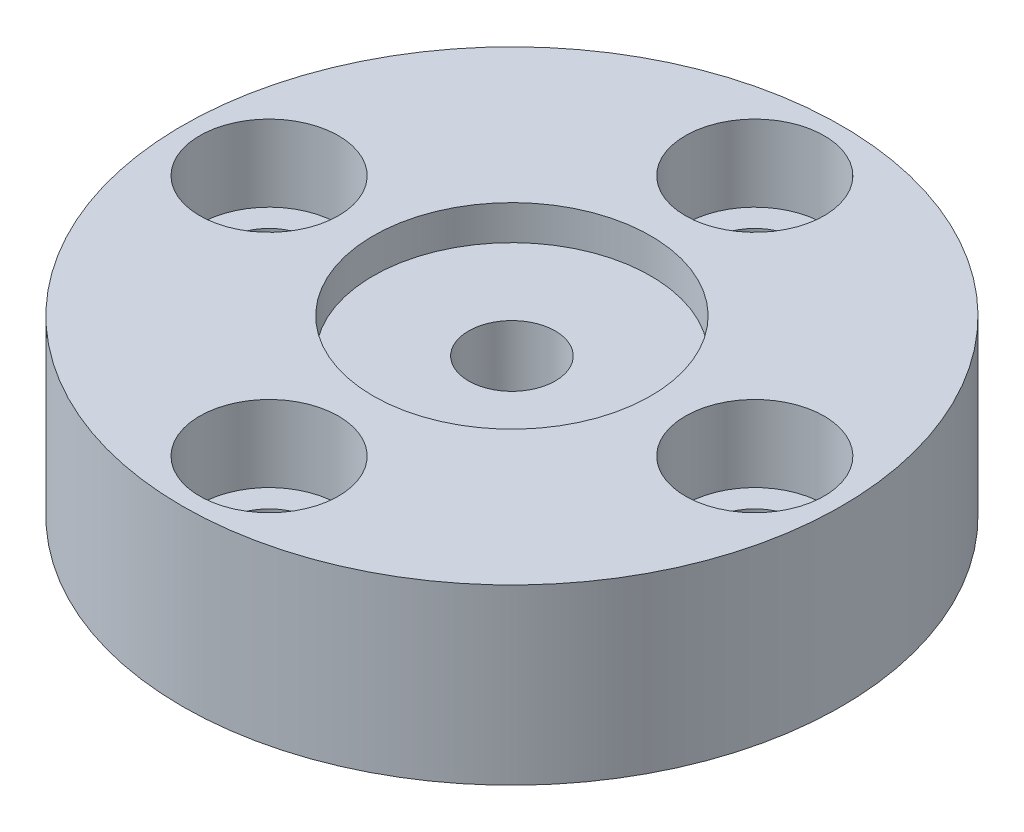
ISO-10303-21;
HEADER;
FILE_DESCRIPTION(('STEP AP214'),'2;1');
FILE_NAME('part.step','',(''),(''),'','','');
FILE_SCHEMA(('AUTOMOTIVE_DESIGN { 1 0 10303 214 1 1 1 1 }'));
ENDSEC;
DATA;
#1=APPLICATION_CONTEXT('core data for automotive mechanical design processes');
#2=APPLICATION_PROTOCOL_DEFINITION('international standard','automotive_design',2000,#1);
#3=PRODUCT_CONTEXT('',#1,'mechanical');
#4=PRODUCT('Part','Part','',(#3));
#5=PRODUCT_RELATED_PRODUCT_CATEGORY('part','',(#4));
#6=PRODUCT_DEFINITION_FORMATION('','',#4);
#7=PRODUCT_DEFINITION_CONTEXT('part definition',#1,'design');
#8=PRODUCT_DEFINITION('design','',#6,#7);
#9=PRODUCT_DEFINITION_SHAPE('','',#8);
#10=(LENGTH_UNIT() NAMED_UNIT(*) SI_UNIT(.MILLI.,.METRE.));
#11=(NAMED_UNIT(*) PLANE_ANGLE_UNIT() SI_UNIT($,.RADIAN.));
#12=(NAMED_UNIT(*) SI_UNIT($,.STERADIAN.) SOLID_ANGLE_UNIT());
#13=UNCERTAINTY_MEASURE_WITH_UNIT(LENGTH_MEASURE(1.E-05),#10,'distance_accuracy_value','');
#14=(GEOMETRIC_REPRESENTATION_CONTEXT(3) GLOBAL_UNCERTAINTY_ASSIGNED_CONTEXT((#13)) GLOBAL_UNIT_ASSIGNED_CONTEXT((#10,
#11,#12)) REPRESENTATION_CONTEXT('',''));
#15=CARTESIAN_POINT('',(0.,0.,0.));
#16=DIRECTION('',(0.,0.,1.));
#17=DIRECTION('',(1.,0.,0.));
#18=AXIS2_PLACEMENT_3D('',#15,#16,#17);
#19=CARTESIAN_POINT('',(0.,10.,0.));
#20=DIRECTION('',(0.,-1.,0.));
#21=DIRECTION('',(0.,0.,-1.));
#22=AXIS2_PLACEMENT_3D('',#19,#20,#21);
#23=CYLINDRICAL_SURFACE('',#22,19.);
#24=CARTESIAN_POINT('',(0.,10.,0.));
#25=DIRECTION('',(0.,1.,0.));
#26=DIRECTION('',(0.,0.,1.));
#27=AXIS2_PLACEMENT_3D('',#24,#25,#26);
#28=CIRCLE('',#27,19.);
#29=CARTESIAN_POINT('',(0.,10.,19.));
#30=VERTEX_POINT('',#29);
#31=EDGE_CURVE('E10',#30,#30,#28,.T.);
#32=ORIENTED_EDGE('',*,*,#31,.F.);
#33=EDGE_LOOP('',(#32));
#34=FACE_BOUND('',#33,.T.);
#35=CARTESIAN_POINT('',(0.,0.,0.));
#36=DIRECTION('',(0.,1.,0.));
#37=DIRECTION('',(0.,0.,1.));
#38=AXIS2_PLACEMENT_3D('',#35,#36,#37);
#39=CIRCLE('',#38,19.);
#40=CARTESIAN_POINT('',(0.,0.,19.));
#41=VERTEX_POINT('',#40);
#42=EDGE_CURVE('E51',#41,#41,#39,.T.);
#43=ORIENTED_EDGE('',*,*,#42,.T.);
#44=EDGE_LOOP('',(#43));
#45=FACE_BOUND('',#44,.T.);
#46=ADVANCED_FACE('F43',(#34,#45),#23,.T.);
#47=CARTESIAN_POINT('',(0.,10.,0.));
#48=DIRECTION('',(0.,1.,0.));
#49=DIRECTION('',(0.,0.,1.));
#50=AXIS2_PLACEMENT_3D('',#47,#48,#49);
#51=PLANE('',#50);
#52=CARTESIAN_POINT('',(-14.,10.,0.));
#53=DIRECTION('',(0.,1.,0.));
#54=DIRECTION('',(1.,0.,0.));
#55=AXIS2_PLACEMENT_3D('',#52,#53,#54);
#56=CIRCLE('',#55,4.);
#57=CARTESIAN_POINT('',(-10.,10.,0.));
#58=VERTEX_POINT('',#57);
#59=EDGE_CURVE('E135',#58,#58,#56,.T.);
#60=ORIENTED_EDGE('',*,*,#59,.F.);
#61=EDGE_LOOP('',(#60));
#62=FACE_BOUND('',#61,.T.);
#63=CARTESIAN_POINT('',(0.,10.,14.));
#64=DIRECTION('',(0.,1.,0.));
#65=DIRECTION('',(0.,0.,-1.));
#66=AXIS2_PLACEMENT_3D('',#63,#64,#65);
#67=CIRCLE('',#66,4.);
#68=CARTESIAN_POINT('',(0.,10.,10.));
#69=VERTEX_POINT('',#68);
#70=EDGE_CURVE('E121',#69,#69,#67,.T.);
#71=ORIENTED_EDGE('',*,*,#70,.F.);
#72=EDGE_LOOP('',(#71));
#73=FACE_BOUND('',#72,.T.);
#74=CARTESIAN_POINT('',(14.,10.,-1.46642216231412E-13));
#75=DIRECTION('',(0.,1.,0.));
#76=DIRECTION('',(-1.,0.,0.));
#77=AXIS2_PLACEMENT_3D('',#74,#75,#76);
#78=CIRCLE('',#77,4.);
#79=CARTESIAN_POINT('',(10.,10.,-1.04744440165294E-13));
#80=VERTEX_POINT('',#79);
#81=EDGE_CURVE('E104',#80,#80,#78,.T.);
#82=ORIENTED_EDGE('',*,*,#81,.F.);
#83=EDGE_LOOP('',(#82));
#84=FACE_BOUND('',#83,.T.);
#85=CARTESIAN_POINT('',(0.,10.,-14.));
#86=DIRECTION('',(0.,1.,0.));
#87=DIRECTION('',(0.,0.,1.));
#88=AXIS2_PLACEMENT_3D('',#85,#86,#87);
#89=CIRCLE('',#88,4.);
#90=CARTESIAN_POINT('',(0.,10.,-10.));
#91=VERTEX_POINT('',#90);
#92=EDGE_CURVE('E79',#91,#91,#89,.T.);
#93=ORIENTED_EDGE('',*,*,#92,.F.);
#94=EDGE_LOOP('',(#93));
#95=FACE_BOUND('',#94,.T.);
#96=CARTESIAN_POINT('',(0.,10.,0.));
#97=DIRECTION('',(0.,1.,0.));
#98=DIRECTION('',(0.,0.,1.));
#99=AXIS2_PLACEMENT_3D('',#96,#97,#98);
#100=CIRCLE('',#99,8.);
#101=CARTESIAN_POINT('',(0.,10.,8.));
#102=VERTEX_POINT('',#101);
#103=EDGE_CURVE('E59',#102,#102,#100,.T.);
#104=ORIENTED_EDGE('',*,*,#103,.F.);
#105=EDGE_LOOP('',(#104));
#106=FACE_BOUND('',#105,.T.);
#107=ORIENTED_EDGE('',*,*,#31,.T.);
#108=EDGE_LOOP('',(#107));
#109=FACE_BOUND('',#108,.T.);
#110=ADVANCED_FACE('F165',(#62,#73,#84,#95,#106,#109),#51,.T.);
#111=CARTESIAN_POINT('',(0.,0.,0.));
#112=DIRECTION('',(0.,1.,0.));
#113=DIRECTION('',(0.,0.,1.));
#114=AXIS2_PLACEMENT_3D('',#111,#112,#113);
#115=PLANE('',#114);
#116=CARTESIAN_POINT('',(-14.,0.,0.));
#117=DIRECTION('',(0.,1.,0.));
#118=DIRECTION('',(1.,0.,0.));
#119=AXIS2_PLACEMENT_3D('',#116,#117,#118);
#120=CIRCLE('',#119,2.5);
#121=CARTESIAN_POINT('',(-11.5,0.,0.));
#122=VERTEX_POINT('',#121);
#123=EDGE_CURVE('E116',#122,#122,#120,.T.);
#124=ORIENTED_EDGE('',*,*,#123,.T.);
#125=EDGE_LOOP('',(#124));
#126=FACE_BOUND('',#125,.T.);
#127=CARTESIAN_POINT('',(0.,0.,14.));
#128=DIRECTION('',(0.,1.,0.));
#129=DIRECTION('',(0.,0.,-1.));
#130=AXIS2_PLACEMENT_3D('',#127,#128,#129);
#131=CIRCLE('',#130,2.5);
#132=CARTESIAN_POINT('',(0.,0.,11.5));
#133=VERTEX_POINT('',#132);
#134=EDGE_CURVE('E99',#133,#133,#131,.T.);
#135=ORIENTED_EDGE('',*,*,#134,.T.);
#136=EDGE_LOOP('',(#135));
#137=FACE_BOUND('',#136,.T.);
#138=CARTESIAN_POINT('',(14.,0.,-1.46642216231412E-13));
#139=DIRECTION('',(0.,1.,0.));
#140=DIRECTION('',(-1.,0.,0.));
#141=AXIS2_PLACEMENT_3D('',#138,#139,#140);
#142=CIRCLE('',#141,2.5);
#143=CARTESIAN_POINT('',(11.5,0.,-1.20456106190088E-13));
#144=VERTEX_POINT('',#143);
#145=EDGE_CURVE('E108',#144,#144,#142,.T.);
#146=ORIENTED_EDGE('',*,*,#145,.T.);
#147=EDGE_LOOP('',(#146));
#148=FACE_BOUND('',#147,.T.);
#149=CARTESIAN_POINT('',(0.,0.,-14.));
#150=DIRECTION('',(0.,1.,0.));
#151=DIRECTION('',(0.,0.,1.));
#152=AXIS2_PLACEMENT_3D('',#149,#150,#151);
#153=CIRCLE('',#152,2.5);
#154=CARTESIAN_POINT('',(0.,0.,-11.5));
#155=VERTEX_POINT('',#154);
#156=EDGE_CURVE('E83',#155,#155,#153,.T.);
#157=ORIENTED_EDGE('',*,*,#156,.T.);
#158=EDGE_LOOP('',(#157));
#159=FACE_BOUND('',#158,.T.);
#160=CARTESIAN_POINT('',(0.,0.,0.));
#161=DIRECTION('',(0.,-1.,0.));
#162=DIRECTION('',(0.,0.,-1.));
#163=AXIS2_PLACEMENT_3D('',#160,#161,#162);
#164=CIRCLE('',#163,6.);
#165=CARTESIAN_POINT('',(0.,0.,-6.));
#166=VERTEX_POINT('',#165);
#167=EDGE_CURVE('E67',#166,#166,#164,.T.);
#168=ORIENTED_EDGE('',*,*,#167,.F.);
#169=EDGE_LOOP('',(#168));
#170=FACE_BOUND('',#169,.T.);
#171=ORIENTED_EDGE('',*,*,#42,.F.);
#172=EDGE_LOOP('',(#171));
#173=FACE_BOUND('',#172,.T.);
#174=ADVANCED_FACE('F143',(#126,#137,#148,#159,#170,#173),#115,.F.);
#175=CARTESIAN_POINT('',(0.,8.,0.));
#176=DIRECTION('',(0.,1.,0.));
#177=DIRECTION('',(0.,0.,1.));
#178=AXIS2_PLACEMENT_3D('',#175,#176,#177);
#179=CYLINDRICAL_SURFACE('',#178,8.);
#180=CARTESIAN_POINT('',(0.,8.,0.));
#181=DIRECTION('',(0.,1.,0.));
#182=DIRECTION('',(0.,0.,1.));
#183=AXIS2_PLACEMENT_3D('',#180,#181,#182);
#184=CIRCLE('',#183,8.);
#185=CARTESIAN_POINT('',(0.,8.,8.));
#186=VERTEX_POINT('',#185);
#187=EDGE_CURVE('E57',#186,#186,#184,.T.);
#188=ORIENTED_EDGE('',*,*,#187,.F.);
#189=EDGE_LOOP('',(#188));
#190=FACE_BOUND('',#189,.T.);
#191=ORIENTED_EDGE('',*,*,#103,.T.);
#192=EDGE_LOOP('',(#191));
#193=FACE_BOUND('',#192,.T.);
#194=ADVANCED_FACE('F177',(#190,#193),#179,.F.);
#195=CARTESIAN_POINT('',(0.,8.,0.));
#196=DIRECTION('',(0.,1.,0.));
#197=DIRECTION('',(0.,0.,1.));
#198=AXIS2_PLACEMENT_3D('',#195,#196,#197);
#199=PLANE('',#198);
#200=CARTESIAN_POINT('',(0.,8.,0.));
#201=DIRECTION('',(0.,1.,0.));
#202=DIRECTION('',(0.,0.,1.));
#203=AXIS2_PLACEMENT_3D('',#200,#201,#202);
#204=CIRCLE('',#203,2.5);
#205=CARTESIAN_POINT('',(0.,8.,2.5));
#206=VERTEX_POINT('',#205);
#207=EDGE_CURVE('E46',#206,#206,#204,.T.);
#208=ORIENTED_EDGE('',*,*,#207,.F.);
#209=EDGE_LOOP('',(#208));
#210=FACE_BOUND('',#209,.T.);
#211=ORIENTED_EDGE('',*,*,#187,.T.);
#212=EDGE_LOOP('',(#211));
#213=FACE_BOUND('',#212,.T.);
#214=ADVANCED_FACE('F179',(#210,#213),#199,.T.);
#215=CARTESIAN_POINT('',(0.,3.,0.));
#216=DIRECTION('',(0.,-1.,0.));
#217=DIRECTION('',(0.,0.,-1.));
#218=AXIS2_PLACEMENT_3D('',#215,#216,#217);
#219=CYLINDRICAL_SURFACE('',#218,6.);
#220=CARTESIAN_POINT('',(0.,3.,0.));
#221=DIRECTION('',(0.,-1.,0.));
#222=DIRECTION('',(0.,0.,-1.));
#223=AXIS2_PLACEMENT_3D('',#220,#221,#222);
#224=CIRCLE('',#223,6.);
#225=CARTESIAN_POINT('',(0.,3.,-6.));
#226=VERTEX_POINT('',#225);
#227=EDGE_CURVE('E63',#226,#226,#224,.T.);
#228=ORIENTED_EDGE('',*,*,#227,.F.);
#229=EDGE_LOOP('',(#228));
#230=FACE_BOUND('',#229,.T.);
#231=ORIENTED_EDGE('',*,*,#167,.T.);
#232=EDGE_LOOP('',(#231));
#233=FACE_BOUND('',#232,.T.);
#234=ADVANCED_FACE('F186',(#230,#233),#219,.F.);
#235=CARTESIAN_POINT('',(0.,3.,0.));
#236=DIRECTION('',(0.,-1.,0.));
#237=DIRECTION('',(0.,0.,-1.));
#238=AXIS2_PLACEMENT_3D('',#235,#236,#237);
#239=PLANE('',#238);
#240=CARTESIAN_POINT('',(0.,3.,0.));
#241=DIRECTION('',(0.,-1.,0.));
#242=DIRECTION('',(0.,0.,-1.));
#243=AXIS2_PLACEMENT_3D('',#240,#241,#242);
#244=CIRCLE('',#243,2.5);
#245=CARTESIAN_POINT('',(0.,3.,-2.5));
#246=VERTEX_POINT('',#245);
#247=EDGE_CURVE('E74',#246,#246,#244,.T.);
#248=ORIENTED_EDGE('',*,*,#247,.F.);
#249=EDGE_LOOP('',(#248));
#250=FACE_BOUND('',#249,.T.);
#251=ORIENTED_EDGE('',*,*,#227,.T.);
#252=EDGE_LOOP('',(#251));
#253=FACE_BOUND('',#252,.T.);
#254=ADVANCED_FACE('F332',(#250,#253),#239,.T.);
#255=CARTESIAN_POINT('',(0.,19.,0.));
#256=DIRECTION('',(0.,-1.,0.));
#257=DIRECTION('',(0.,0.,-1.));
#258=AXIS2_PLACEMENT_3D('',#255,#256,#257);
#259=CYLINDRICAL_SURFACE('',#258,2.5);
#260=ORIENTED_EDGE('',*,*,#207,.T.);
#261=EDGE_LOOP('',(#260));
#262=FACE_BOUND('',#261,.T.);
#263=ORIENTED_EDGE('',*,*,#247,.T.);
#264=EDGE_LOOP('',(#263));
#265=FACE_BOUND('',#264,.T.);
#266=ADVANCED_FACE('F324',(#262,#265),#259,.F.);
#267=CARTESIAN_POINT('',(0.,5.6,-14.));
#268=DIRECTION('',(0.,1.,0.));
#269=DIRECTION('',(0.,0.,1.));
#270=AXIS2_PLACEMENT_3D('',#267,#268,#269);
#271=CYLINDRICAL_SURFACE('',#270,4.);
#272=CARTESIAN_POINT('',(0.,5.6,-14.));
#273=DIRECTION('',(0.,1.,0.));
#274=DIRECTION('',(0.,0.,1.));
#275=AXIS2_PLACEMENT_3D('',#272,#273,#274);
#276=CIRCLE('',#275,4.);
#277=CARTESIAN_POINT('',(0.,5.6,-10.));
#278=VERTEX_POINT('',#277);
#279=EDGE_CURVE('E78',#278,#278,#276,.T.);
#280=ORIENTED_EDGE('',*,*,#279,.F.);
#281=EDGE_LOOP('',(#280));
#282=FACE_BOUND('',#281,.T.);
#283=ORIENTED_EDGE('',*,*,#92,.T.);
#284=EDGE_LOOP('',(#283));
#285=FACE_BOUND('',#284,.T.);
#286=ADVANCED_FACE('F316',(#282,#285),#271,.F.);
#287=CARTESIAN_POINT('',(0.,5.6,-14.));
#288=DIRECTION('',(0.,1.,0.));
#289=DIRECTION('',(0.,0.,1.));
#290=AXIS2_PLACEMENT_3D('',#287,#288,#289);
#291=PLANE('',#290);
#292=CARTESIAN_POINT('',(0.,5.6,-14.));
#293=DIRECTION('',(0.,1.,0.));
#294=DIRECTION('',(0.,0.,1.));
#295=AXIS2_PLACEMENT_3D('',#292,#293,#294);
#296=CIRCLE('',#295,2.5);
#297=CARTESIAN_POINT('',(0.,5.6,-11.5));
#298=VERTEX_POINT('',#297);
#299=EDGE_CURVE('E87',#298,#298,#296,.T.);
#300=ORIENTED_EDGE('',*,*,#299,.F.);
#301=EDGE_LOOP('',(#300));
#302=FACE_BOUND('',#301,.T.);
#303=ORIENTED_EDGE('',*,*,#279,.T.);
#304=EDGE_LOOP('',(#303));
#305=FACE_BOUND('',#304,.T.);
#306=ADVANCED_FACE('F307',(#302,#305),#291,.T.);
#307=CARTESIAN_POINT('',(0.,0.,-14.));
#308=DIRECTION('',(0.,1.,0.));
#309=DIRECTION('',(0.,0.,1.));
#310=AXIS2_PLACEMENT_3D('',#307,#308,#309);
#311=CYLINDRICAL_SURFACE('',#310,2.5);
#312=ORIENTED_EDGE('',*,*,#156,.F.);
#313=EDGE_LOOP('',(#312));
#314=FACE_BOUND('',#313,.T.);
#315=ORIENTED_EDGE('',*,*,#299,.T.);
#316=EDGE_LOOP('',(#315));
#317=FACE_BOUND('',#316,.T.);
#318=ADVANCED_FACE('F219',(#314,#317),#311,.F.);
#319=CARTESIAN_POINT('',(14.,5.6,-1.46642216231412E-13));
#320=DIRECTION('',(0.,1.,0.));
#321=DIRECTION('',(-1.,0.,0.));
#322=AXIS2_PLACEMENT_3D('',#319,#320,#321);
#323=CYLINDRICAL_SURFACE('',#322,4.);
#324=CARTESIAN_POINT('',(14.,5.6,-1.46642216231412E-13));
#325=DIRECTION('',(0.,1.,0.));
#326=DIRECTION('',(-1.,0.,0.));
#327=AXIS2_PLACEMENT_3D('',#324,#325,#326);
#328=CIRCLE('',#327,4.);
#329=CARTESIAN_POINT('',(10.,5.6,-1.04744440165294E-13));
#330=VERTEX_POINT('',#329);
#331=EDGE_CURVE('E95',#330,#330,#328,.T.);
#332=ORIENTED_EDGE('',*,*,#331,.F.);
#333=EDGE_LOOP('',(#332));
#334=FACE_BOUND('',#333,.T.);
#335=ORIENTED_EDGE('',*,*,#81,.T.);
#336=EDGE_LOOP('',(#335));
#337=FACE_BOUND('',#336,.T.);
#338=ADVANCED_FACE('F213',(#334,#337),#323,.F.);
#339=CARTESIAN_POINT('',(14.,5.6,-1.46642216231412E-13));
#340=DIRECTION('',(0.,1.,0.));
#341=DIRECTION('',(-1.,0.,0.));
#342=AXIS2_PLACEMENT_3D('',#339,#340,#341);
#343=PLANE('',#342);
#344=CARTESIAN_POINT('',(14.,5.6,-1.46642216231412E-13));
#345=DIRECTION('',(0.,1.,0.));
#346=DIRECTION('',(-1.,0.,0.));
#347=AXIS2_PLACEMENT_3D('',#344,#345,#346);
#348=CIRCLE('',#347,2.5);
#349=CARTESIAN_POINT('',(11.5,5.6,-1.20456106190088E-13));
#350=VERTEX_POINT('',#349);
#351=EDGE_CURVE('E100',#350,#350,#348,.T.);
#352=ORIENTED_EDGE('',*,*,#351,.F.);
#353=EDGE_LOOP('',(#352));
#354=FACE_BOUND('',#353,.T.);
#355=ORIENTED_EDGE('',*,*,#331,.T.);
#356=EDGE_LOOP('',(#355));
#357=FACE_BOUND('',#356,.T.);
#358=ADVANCED_FACE('F218',(#354,#357),#343,.T.);
#359=CARTESIAN_POINT('',(14.,0.,-1.46642216231412E-13));
#360=DIRECTION('',(0.,1.,0.));
#361=DIRECTION('',(-1.,0.,0.));
#362=AXIS2_PLACEMENT_3D('',#359,#360,#361);
#363=CYLINDRICAL_SURFACE('',#362,2.5);
#364=ORIENTED_EDGE('',*,*,#145,.F.);
#365=EDGE_LOOP('',(#364));
#366=FACE_BOUND('',#365,.T.);
#367=ORIENTED_EDGE('',*,*,#351,.T.);
#368=EDGE_LOOP('',(#367));
#369=FACE_BOUND('',#368,.T.);
#370=ADVANCED_FACE('F232',(#366,#369),#363,.F.);
#371=CARTESIAN_POINT('',(0.,5.6,14.));
#372=DIRECTION('',(0.,1.,0.));
#373=DIRECTION('',(0.,0.,-1.));
#374=AXIS2_PLACEMENT_3D('',#371,#372,#373);
#375=CYLINDRICAL_SURFACE('',#374,4.);
#376=CARTESIAN_POINT('',(0.,5.6,14.));
#377=DIRECTION('',(0.,1.,0.));
#378=DIRECTION('',(0.,0.,-1.));
#379=AXIS2_PLACEMENT_3D('',#376,#377,#378);
#380=CIRCLE('',#379,4.);
#381=CARTESIAN_POINT('',(0.,5.6,10.));
#382=VERTEX_POINT('',#381);
#383=EDGE_CURVE('E112',#382,#382,#380,.T.);
#384=ORIENTED_EDGE('',*,*,#383,.F.);
#385=EDGE_LOOP('',(#384));
#386=FACE_BOUND('',#385,.T.);
#387=ORIENTED_EDGE('',*,*,#70,.T.);
#388=EDGE_LOOP('',(#387));
#389=FACE_BOUND('',#388,.T.);
#390=ADVANCED_FACE('F244',(#386,#389),#375,.F.);
#391=CARTESIAN_POINT('',(0.,5.6,14.));
#392=DIRECTION('',(0.,1.,0.));
#393=DIRECTION('',(0.,0.,-1.));
#394=AXIS2_PLACEMENT_3D('',#391,#392,#393);
#395=PLANE('',#394);
#396=CARTESIAN_POINT('',(0.,5.6,14.));
#397=DIRECTION('',(0.,1.,0.));
#398=DIRECTION('',(0.,0.,-1.));
#399=AXIS2_PLACEMENT_3D('',#396,#397,#398);
#400=CIRCLE('',#399,2.5);
#401=CARTESIAN_POINT('',(0.,5.6,11.5));
#402=VERTEX_POINT('',#401);
#403=EDGE_CURVE('E117',#402,#402,#400,.T.);
#404=ORIENTED_EDGE('',*,*,#403,.F.);
#405=EDGE_LOOP('',(#404));
#406=FACE_BOUND('',#405,.T.);
#407=ORIENTED_EDGE('',*,*,#383,.T.);
#408=EDGE_LOOP('',(#407));
#409=FACE_BOUND('',#408,.T.);
#410=ADVANCED_FACE('F256',(#406,#409),#395,.T.);
#411=CARTESIAN_POINT('',(0.,0.,14.));
#412=DIRECTION('',(0.,1.,0.));
#413=DIRECTION('',(0.,0.,-1.));
#414=AXIS2_PLACEMENT_3D('',#411,#412,#413);
#415=CYLINDRICAL_SURFACE('',#414,2.5);
#416=ORIENTED_EDGE('',*,*,#134,.F.);
#417=EDGE_LOOP('',(#416));
#418=FACE_BOUND('',#417,.T.);
#419=ORIENTED_EDGE('',*,*,#403,.T.);
#420=EDGE_LOOP('',(#419));
#421=FACE_BOUND('',#420,.T.);
#422=ADVANCED_FACE('F161',(#418,#421),#415,.F.);
#423=CARTESIAN_POINT('',(-14.,5.6,0.));
#424=DIRECTION('',(0.,1.,0.));
#425=DIRECTION('',(1.,0.,0.));
#426=AXIS2_PLACEMENT_3D('',#423,#424,#425);
#427=CYLINDRICAL_SURFACE('',#426,4.);
#428=CARTESIAN_POINT('',(-14.,5.6,0.));
#429=DIRECTION('',(0.,1.,0.));
#430=DIRECTION('',(1.,0.,0.));
#431=AXIS2_PLACEMENT_3D('',#428,#429,#430);
#432=CIRCLE('',#431,4.);
#433=CARTESIAN_POINT('',(-10.,5.6,0.));
#434=VERTEX_POINT('',#433);
#435=EDGE_CURVE('E91',#434,#434,#432,.T.);
#436=ORIENTED_EDGE('',*,*,#435,.F.);
#437=EDGE_LOOP('',(#436));
#438=FACE_BOUND('',#437,.T.);
#439=ORIENTED_EDGE('',*,*,#59,.T.);
#440=EDGE_LOOP('',(#439));
#441=FACE_BOUND('',#440,.T.);
#442=ADVANCED_FACE('F155',(#438,#441),#427,.F.);
#443=CARTESIAN_POINT('',(-14.,5.6,0.));
#444=DIRECTION('',(0.,1.,0.));
#445=DIRECTION('',(1.,0.,0.));
#446=AXIS2_PLACEMENT_3D('',#443,#444,#445);
#447=PLANE('',#446);
#448=CARTESIAN_POINT('',(-14.,5.6,0.));
#449=DIRECTION('',(0.,1.,0.));
#450=DIRECTION('',(1.,0.,0.));
#451=AXIS2_PLACEMENT_3D('',#448,#449,#450);
#452=CIRCLE('',#451,2.5);
#453=CARTESIAN_POINT('',(-11.5,5.6,0.));
#454=VERTEX_POINT('',#453);
#455=EDGE_CURVE('E131',#454,#454,#452,.T.);
#456=ORIENTED_EDGE('',*,*,#455,.F.);
#457=EDGE_LOOP('',(#456));
#458=FACE_BOUND('',#457,.T.);
#459=ORIENTED_EDGE('',*,*,#435,.T.);
#460=EDGE_LOOP('',(#459));
#461=FACE_BOUND('',#460,.T.);
#462=ADVANCED_FACE('F149',(#458,#461),#447,.T.);
#463=CARTESIAN_POINT('',(-14.,0.,0.));
#464=DIRECTION('',(0.,1.,0.));
#465=DIRECTION('',(1.,0.,0.));
#466=AXIS2_PLACEMENT_3D('',#463,#464,#465);
#467=CYLINDRICAL_SURFACE('',#466,2.5);
#468=ORIENTED_EDGE('',*,*,#123,.F.);
#469=EDGE_LOOP('',(#468));
#470=FACE_BOUND('',#469,.T.);
#471=ORIENTED_EDGE('',*,*,#455,.T.);
#472=EDGE_LOOP('',(#471));
#473=FACE_BOUND('',#472,.T.);
#474=ADVANCED_FACE('F146',(#470,#473),#467,.F.);
#475=CLOSED_SHELL('',(#46,#110,#174,#194,#214,#234,#254,#266,#286,#306,#318,#338,#358,#370,#390,
#410,#422,#442,#462,#474));
#476=MANIFOLD_SOLID_BREP('B2',#475);
#477=ADVANCED_BREP_SHAPE_REPRESENTATION('',(#18,#476),#14);
#478=SHAPE_DEFINITION_REPRESENTATION(#9,#477);
ENDSEC;
END-ISO-10303-21;
